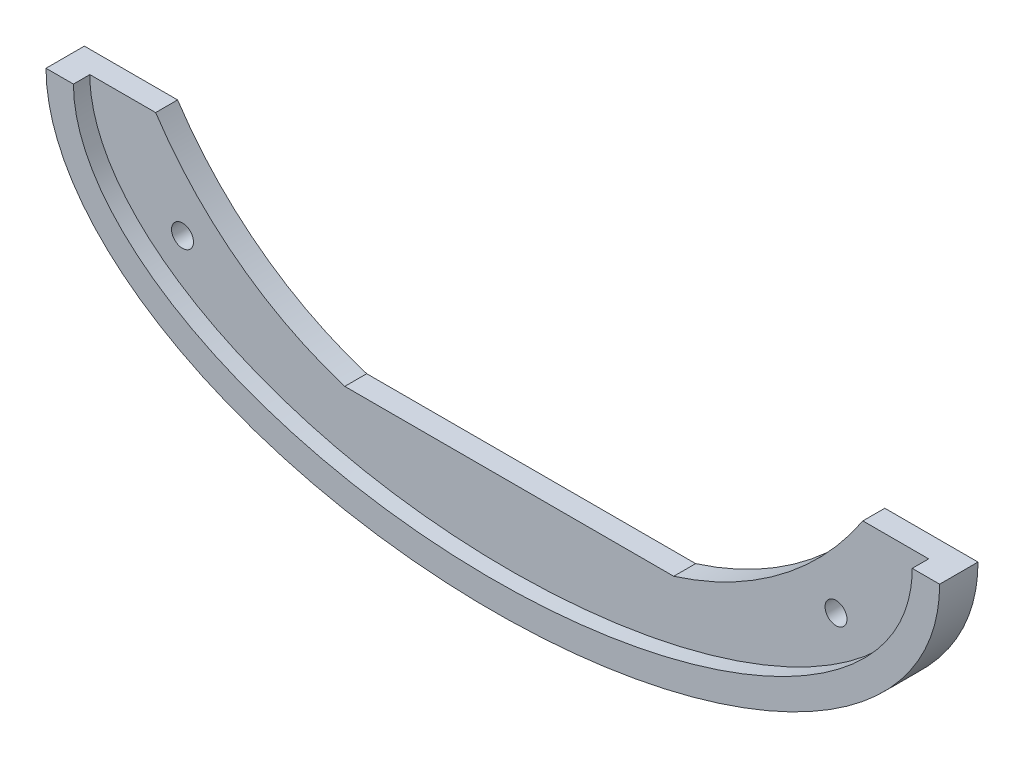
ISO-10303-21;
HEADER;
FILE_DESCRIPTION(('STEP AP214'),'2;1');
FILE_NAME('part.step','',(''),(''),'','','');
FILE_SCHEMA(('AUTOMOTIVE_DESIGN { 1 0 10303 214 1 1 1 1 }'));
ENDSEC;
DATA;
#1=APPLICATION_CONTEXT('core data for automotive mechanical design processes');
#2=APPLICATION_PROTOCOL_DEFINITION('international standard','automotive_design',2000,#1);
#3=PRODUCT_CONTEXT('',#1,'mechanical');
#4=PRODUCT('Part','Part','',(#3));
#5=PRODUCT_RELATED_PRODUCT_CATEGORY('part','',(#4));
#6=PRODUCT_DEFINITION_FORMATION('','',#4);
#7=PRODUCT_DEFINITION_CONTEXT('part definition',#1,'design');
#8=PRODUCT_DEFINITION('design','',#6,#7);
#9=PRODUCT_DEFINITION_SHAPE('','',#8);
#10=(LENGTH_UNIT() NAMED_UNIT(*) SI_UNIT(.MILLI.,.METRE.));
#11=(NAMED_UNIT(*) PLANE_ANGLE_UNIT() SI_UNIT($,.RADIAN.));
#12=(NAMED_UNIT(*) SI_UNIT($,.STERADIAN.) SOLID_ANGLE_UNIT());
#13=UNCERTAINTY_MEASURE_WITH_UNIT(LENGTH_MEASURE(1.E-05),#10,'distance_accuracy_value','');
#14=(GEOMETRIC_REPRESENTATION_CONTEXT(3) GLOBAL_UNCERTAINTY_ASSIGNED_CONTEXT((#13)) GLOBAL_UNIT_ASSIGNED_CONTEXT((#10,
#11,#12)) REPRESENTATION_CONTEXT('',''));
#15=CARTESIAN_POINT('',(0.,0.,0.));
#16=DIRECTION('',(0.,0.,1.));
#17=DIRECTION('',(1.,0.,0.));
#18=AXIS2_PLACEMENT_3D('',#15,#16,#17);
#19=CARTESIAN_POINT('',(0.,40.,-176.386654892759));
#20=DIRECTION('',(0.,0.,1.));
#21=DIRECTION('',(1.,0.,0.));
#22=AXIS2_PLACEMENT_3D('',#19,#20,#21);
#23=ELLIPSE('',#22,76.5,40.);
#24=DIRECTION('',(0.,0.,1.));
#25=VECTOR('',#24,1.);
#26=SURFACE_OF_LINEAR_EXTRUSION('',#23,#25);
#27=CARTESIAN_POINT('',(0.,40.,-3.));
#28=DIRECTION('',(0.,0.,-1.));
#29=DIRECTION('',(1.,0.,0.));
#30=AXIS2_PLACEMENT_3D('',#27,#28,#29);
#31=ELLIPSE('',#30,76.5,40.);
#32=CARTESIAN_POINT('',(76.5,40.,-3.00000000000006));
#33=VERTEX_POINT('',#32);
#34=CARTESIAN_POINT('',(-76.5,40.,-3.));
#35=VERTEX_POINT('',#34);
#36=EDGE_CURVE('E181',#33,#35,#31,.T.);
#37=ORIENTED_EDGE('',*,*,#36,.T.);
#38=DIRECTION('',(0.,0.,1.));
#39=VECTOR('',#38,1.);
#40=CARTESIAN_POINT('',(-76.5,40.,-176.386654892759));
#41=LINE('',#40,#39);
#42=CARTESIAN_POINT('',(-76.5,40.,0.));
#43=VERTEX_POINT('',#42);
#44=EDGE_CURVE('E155',#35,#43,#41,.T.);
#45=ORIENTED_EDGE('',*,*,#44,.T.);
#46=CARTESIAN_POINT('',(0.,40.,0.));
#47=DIRECTION('',(0.,0.,1.));
#48=DIRECTION('',(1.,0.,0.));
#49=AXIS2_PLACEMENT_3D('',#46,#47,#48);
#50=ELLIPSE('',#49,76.5,40.);
#51=CARTESIAN_POINT('',(76.5,40.,0.));
#52=VERTEX_POINT('',#51);
#53=EDGE_CURVE('E48',#43,#52,#50,.T.);
#54=ORIENTED_EDGE('',*,*,#53,.T.);
#55=DIRECTION('',(0.,0.,1.));
#56=VECTOR('',#55,1.);
#57=CARTESIAN_POINT('',(76.5,40.,-176.386654892759));
#58=LINE('',#57,#56);
#59=EDGE_CURVE('E55',#33,#52,#58,.T.);
#60=ORIENTED_EDGE('',*,*,#59,.F.);
#61=EDGE_LOOP('',(#37,#45,#54,#60));
#62=FACE_BOUND('',#61,.T.);
#63=ADVANCED_FACE('F38',(#62),#26,.F.);
#64=CARTESIAN_POINT('',(64.5,40.,4.));
#65=DIRECTION('',(0.,-1.,0.));
#66=DIRECTION('',(0.,0.,-1.));
#67=AXIS2_PLACEMENT_3D('',#64,#65,#66);
#68=PLANE('',#67);
#69=ORIENTED_EDGE('',*,*,#59,.T.);
#70=DIRECTION('',(1.,0.,0.));
#71=VECTOR('',#70,1.);
#72=CARTESIAN_POINT('',(-81.5,40.,0.));
#73=LINE('',#72,#71);
#74=CARTESIAN_POINT('',(81.5,40.,0.));
#75=VERTEX_POINT('',#74);
#76=EDGE_CURVE('E107',#52,#75,#73,.T.);
#77=ORIENTED_EDGE('',*,*,#76,.T.);
#78=DIRECTION('',(0.,0.,1.));
#79=VECTOR('',#78,1.);
#80=CARTESIAN_POINT('',(81.5,40.,-176.386654892759));
#81=LINE('',#80,#79);
#82=CARTESIAN_POINT('',(81.5,40.,-7.00000000000001));
#83=VERTEX_POINT('',#82);
#84=EDGE_CURVE('E116',#83,#75,#81,.T.);
#85=ORIENTED_EDGE('',*,*,#84,.F.);
#86=DIRECTION('',(-1.,0.,0.));
#87=VECTOR('',#86,1.);
#88=CARTESIAN_POINT('',(81.5,40.,-7.00000000000001));
#89=LINE('',#88,#87);
#90=CARTESIAN_POINT('',(64.5,40.,-7.));
#91=VERTEX_POINT('',#90);
#92=EDGE_CURVE('E63',#83,#91,#89,.T.);
#93=ORIENTED_EDGE('',*,*,#92,.T.);
#94=DIRECTION('',(0.,0.,1.));
#95=VECTOR('',#94,1.);
#96=CARTESIAN_POINT('',(64.5,40.,-7.));
#97=LINE('',#96,#95);
#98=CARTESIAN_POINT('',(64.5,40.,-3.));
#99=VERTEX_POINT('',#98);
#100=EDGE_CURVE('E171',#91,#99,#97,.T.);
#101=ORIENTED_EDGE('',*,*,#100,.T.);
#102=DIRECTION('',(1.,0.,0.));
#103=VECTOR('',#102,1.);
#104=CARTESIAN_POINT('',(76.5,40.,-3.));
#105=LINE('',#104,#103);
#106=EDGE_CURVE('E183',#99,#33,#105,.T.);
#107=ORIENTED_EDGE('',*,*,#106,.T.);
#108=EDGE_LOOP('',(#69,#77,#85,#93,#101,#107));
#109=FACE_BOUND('',#108,.T.);
#110=ADVANCED_FACE('F40',(#109),#68,.F.);
#111=CARTESIAN_POINT('',(-76.5,40.,4.));
#112=DIRECTION('',(0.,-1.,0.));
#113=DIRECTION('',(0.,0.,-1.));
#114=AXIS2_PLACEMENT_3D('',#111,#112,#113);
#115=PLANE('',#114);
#116=DIRECTION('',(0.,0.,1.));
#117=VECTOR('',#116,1.);
#118=CARTESIAN_POINT('',(-81.5,40.,-176.386654892759));
#119=LINE('',#118,#117);
#120=CARTESIAN_POINT('',(-81.5,40.,-7.00000000000001));
#121=VERTEX_POINT('',#120);
#122=CARTESIAN_POINT('',(-81.5,40.,0.));
#123=VERTEX_POINT('',#122);
#124=EDGE_CURVE('E121',#121,#123,#119,.T.);
#125=ORIENTED_EDGE('',*,*,#124,.T.);
#126=EDGE_CURVE('E109',#123,#43,#73,.T.);
#127=ORIENTED_EDGE('',*,*,#126,.T.);
#128=ORIENTED_EDGE('',*,*,#44,.F.);
#129=DIRECTION('',(1.,0.,0.));
#130=VECTOR('',#129,1.);
#131=CARTESIAN_POINT('',(-64.5,40.,-3.));
#132=LINE('',#131,#130);
#133=CARTESIAN_POINT('',(-64.5,40.,-3.));
#134=VERTEX_POINT('',#133);
#135=EDGE_CURVE('E178',#35,#134,#132,.T.);
#136=ORIENTED_EDGE('',*,*,#135,.T.);
#137=DIRECTION('',(0.,0.,1.));
#138=VECTOR('',#137,1.);
#139=CARTESIAN_POINT('',(-64.5,40.,-7.));
#140=LINE('',#139,#138);
#141=CARTESIAN_POINT('',(-64.5,40.,-7.));
#142=VERTEX_POINT('',#141);
#143=EDGE_CURVE('E174',#142,#134,#140,.T.);
#144=ORIENTED_EDGE('',*,*,#143,.F.);
#145=DIRECTION('',(1.,0.,0.));
#146=VECTOR('',#145,1.);
#147=CARTESIAN_POINT('',(-81.5,40.,-7.00000000000001));
#148=LINE('',#147,#146);
#149=EDGE_CURVE('E154',#121,#142,#148,.T.);
#150=ORIENTED_EDGE('',*,*,#149,.F.);
#151=EDGE_LOOP('',(#125,#127,#128,#136,#144,#150));
#152=FACE_BOUND('',#151,.T.);
#153=ADVANCED_FACE('F145',(#152),#115,.F.);
#154=CARTESIAN_POINT('',(0.,40.,-7.));
#155=DIRECTION('',(0.,0.,-1.));
#156=DIRECTION('',(-1.,0.,0.));
#157=AXIS2_PLACEMENT_3D('',#154,#155,#156);
#158=PLANE('',#157);
#159=CARTESIAN_POINT('',(-81.5,40.,-7.00000000000006));
#160=CARTESIAN_POINT('',(-81.5,36.7505295268644,-7.00000000000006));
#161=CARTESIAN_POINT('',(-80.2609957361757,30.2809682014024,-7.00000000000006));
#162=CARTESIAN_POINT('',(-73.3217409081439,18.4427697279927,-7.00000000000006));
#163=CARTESIAN_POINT('',(-57.7397657128275,6.42877793137961,-7.00000000000006));
#164=CARTESIAN_POINT('',(-31.0655415341109,-2.85144915391041,-7.00000000000006));
#165=CARTESIAN_POINT('',(0.,-6.07427542304479,-7.00000000000006));
#166=CARTESIAN_POINT('',(31.0655415341109,-2.85144915391042,-7.00000000000006));
#167=CARTESIAN_POINT('',(57.7397657128275,6.42877793137959,-7.00000000000006));
#168=CARTESIAN_POINT('',(73.3217409081439,18.4427697279927,-7.00000000000006));
#169=CARTESIAN_POINT('',(80.2609957361757,30.2809682014024,-7.00000000000006));
#170=CARTESIAN_POINT('',(81.5,36.7505295268644,-7.00000000000006));
#171=CARTESIAN_POINT('',(81.5,40.,-7.00000000000006));
#172=B_SPLINE_CURVE_WITH_KNOTS('',3,(#159,#160,#161,#162,#163,#164,#165,#166,#167,#168,#169,
#170,#171),.UNSPECIFIED.,.F.,.F.,(4,1,1,1,1,1,1,1,1,1,4),(3.14159265358979,3.33794219443916,
3.53429173528852,3.92699081698724,4.31968989868597,4.71238898038469,5.10508806208341,
5.49778714378214,5.89048622548086,6.08683576633022,6.28318530717959),.UNSPECIFIED.);
#173=EDGE_CURVE('E119',#121,#83,#172,.T.);
#174=ORIENTED_EDGE('',*,*,#173,.F.);
#175=ORIENTED_EDGE('',*,*,#149,.T.);
#176=CARTESIAN_POINT('',(-10.6544644361917,75.5594606519764,-7.));
#177=DIRECTION('',(0.,0.,1.));
#178=DIRECTION('',(-1.,0.,0.));
#179=AXIS2_PLACEMENT_3D('',#176,#177,#178);
#180=CIRCLE('',#179,64.5276447889802);
#181=CARTESIAN_POINT('',(-30.,14.,-7.));
#182=VERTEX_POINT('',#181);
#183=EDGE_CURVE('E180',#142,#182,#180,.T.);
#184=ORIENTED_EDGE('',*,*,#183,.T.);
#185=DIRECTION('',(1.,0.,0.));
#186=VECTOR('',#185,1.);
#187=CARTESIAN_POINT('',(30.,14.,-7.));
#188=LINE('',#187,#186);
#189=CARTESIAN_POINT('',(30.,14.,-7.));
#190=VERTEX_POINT('',#189);
#191=EDGE_CURVE('E194',#182,#190,#188,.T.);
#192=ORIENTED_EDGE('',*,*,#191,.T.);
#193=CARTESIAN_POINT('',(10.6544644361917,75.5594606519764,-7.));
#194=DIRECTION('',(0.,0.,1.));
#195=DIRECTION('',(-1.,0.,0.));
#196=AXIS2_PLACEMENT_3D('',#193,#194,#195);
#197=CIRCLE('',#196,64.5276447889802);
#198=EDGE_CURVE('E177',#190,#91,#197,.T.);
#199=ORIENTED_EDGE('',*,*,#198,.T.);
#200=ORIENTED_EDGE('',*,*,#92,.F.);
#201=EDGE_LOOP('',(#174,#175,#184,#192,#199,#200));
#202=FACE_BOUND('',#201,.T.);
#203=CARTESIAN_POINT('',(59.6,23.,-7.));
#204=DIRECTION('',(0.,0.,-1.));
#205=DIRECTION('',(-1.,0.,0.));
#206=AXIS2_PLACEMENT_3D('',#203,#204,#205);
#207=CIRCLE('',#206,2.);
#208=CARTESIAN_POINT('',(57.6,23.,-7.));
#209=VERTEX_POINT('',#208);
#210=EDGE_CURVE('E192',#209,#209,#207,.T.);
#211=ORIENTED_EDGE('',*,*,#210,.F.);
#212=EDGE_LOOP('',(#211));
#213=FACE_BOUND('',#212,.T.);
#214=CARTESIAN_POINT('',(-59.6,23.,-7.));
#215=DIRECTION('',(0.,0.,-1.));
#216=DIRECTION('',(-1.,0.,0.));
#217=AXIS2_PLACEMENT_3D('',#214,#215,#216);
#218=CIRCLE('',#217,2.);
#219=CARTESIAN_POINT('',(-61.6,23.,-7.));
#220=VERTEX_POINT('',#219);
#221=EDGE_CURVE('E201',#220,#220,#218,.T.);
#222=ORIENTED_EDGE('',*,*,#221,.F.);
#223=EDGE_LOOP('',(#222));
#224=FACE_BOUND('',#223,.T.);
#225=ADVANCED_FACE('F139',(#202,#213,#224),#158,.T.);
#226=CARTESIAN_POINT('',(-81.5,40.,-176.386654892759));
#227=CARTESIAN_POINT('',(-81.5,36.7505295268644,-176.386654892759));
#228=CARTESIAN_POINT('',(-80.2609957361757,30.2809682014024,-176.386654892759));
#229=CARTESIAN_POINT('',(-73.3217409081439,18.4427697279927,-176.386654892759));
#230=CARTESIAN_POINT('',(-57.7397657128275,6.42877793137961,-176.386654892759));
#231=CARTESIAN_POINT('',(-31.0655415341109,-2.85144915391041,-176.386654892759));
#232=CARTESIAN_POINT('',(0.,-6.07427542304479,-176.386654892759));
#233=CARTESIAN_POINT('',(31.0655415341109,-2.85144915391042,-176.386654892759));
#234=CARTESIAN_POINT('',(57.7397657128275,6.42877793137959,-176.386654892759));
#235=CARTESIAN_POINT('',(73.3217409081439,18.4427697279927,-176.386654892759));
#236=CARTESIAN_POINT('',(80.2609957361757,30.2809682014024,-176.386654892759));
#237=CARTESIAN_POINT('',(81.5,36.7505295268644,-176.386654892759));
#238=CARTESIAN_POINT('',(81.5,40.,-176.386654892759));
#239=B_SPLINE_CURVE_WITH_KNOTS('',3,(#226,#227,#228,#229,#230,#231,#232,#233,#234,#235,#236,
#237,#238),.UNSPECIFIED.,.F.,.F.,(4,1,1,1,1,1,1,1,1,1,4),(3.14159265358979,3.33794219443916,
3.53429173528852,3.92699081698724,4.31968989868597,4.71238898038469,5.10508806208341,
5.49778714378214,5.89048622548086,6.08683576633022,6.28318530717959),.UNSPECIFIED.);
#240=DIRECTION('',(0.,0.,1.));
#241=VECTOR('',#240,1.);
#242=SURFACE_OF_LINEAR_EXTRUSION('',#239,#241);
#243=CARTESIAN_POINT('',(-81.5,40.,0.));
#244=CARTESIAN_POINT('',(-81.5,36.7505295268644,0.));
#245=CARTESIAN_POINT('',(-80.2609957361757,30.2809682014024,0.));
#246=CARTESIAN_POINT('',(-73.3217409081439,18.4427697279927,0.));
#247=CARTESIAN_POINT('',(-57.7397657128275,6.42877793137961,0.));
#248=CARTESIAN_POINT('',(-31.0655415341109,-2.85144915391041,0.));
#249=CARTESIAN_POINT('',(0.,-6.07427542304479,0.));
#250=CARTESIAN_POINT('',(31.0655415341109,-2.85144915391042,0.));
#251=CARTESIAN_POINT('',(57.7397657128275,6.42877793137959,0.));
#252=CARTESIAN_POINT('',(73.3217409081439,18.4427697279927,0.));
#253=CARTESIAN_POINT('',(80.2609957361757,30.2809682014024,0.));
#254=CARTESIAN_POINT('',(81.5,36.7505295268644,0.));
#255=CARTESIAN_POINT('',(81.5,40.,0.));
#256=B_SPLINE_CURVE_WITH_KNOTS('',3,(#243,#244,#245,#246,#247,#248,#249,#250,#251,#252,#253,
#254,#255),.UNSPECIFIED.,.F.,.F.,(4,1,1,1,1,1,1,1,1,1,4),(3.14159265358979,3.33794219443916,
3.53429173528852,3.92699081698724,4.31968989868597,4.71238898038469,5.10508806208341,
5.49778714378214,5.89048622548086,6.08683576633022,6.28318530717959),.UNSPECIFIED.);
#257=EDGE_CURVE('E11',#123,#75,#256,.T.);
#258=ORIENTED_EDGE('',*,*,#257,.F.);
#259=ORIENTED_EDGE('',*,*,#124,.F.);
#260=ORIENTED_EDGE('',*,*,#173,.T.);
#261=ORIENTED_EDGE('',*,*,#84,.T.);
#262=EDGE_LOOP('',(#258,#259,#260,#261));
#263=FACE_BOUND('',#262,.T.);
#264=ADVANCED_FACE('F118',(#263),#242,.T.);
#265=CARTESIAN_POINT('',(0.,40.,-3.));
#266=DIRECTION('',(0.,0.,-1.));
#267=DIRECTION('',(-1.,0.,0.));
#268=AXIS2_PLACEMENT_3D('',#265,#266,#267);
#269=PLANE('',#268);
#270=CARTESIAN_POINT('',(-10.6544644361917,75.5594606519764,-3.));
#271=DIRECTION('',(0.,0.,1.));
#272=DIRECTION('',(-1.,0.,0.));
#273=AXIS2_PLACEMENT_3D('',#270,#271,#272);
#274=CIRCLE('',#273,64.5276447889802);
#275=CARTESIAN_POINT('',(-30.,14.,-3.));
#276=VERTEX_POINT('',#275);
#277=EDGE_CURVE('E189',#134,#276,#274,.T.);
#278=ORIENTED_EDGE('',*,*,#277,.F.);
#279=ORIENTED_EDGE('',*,*,#135,.F.);
#280=ORIENTED_EDGE('',*,*,#36,.F.);
#281=ORIENTED_EDGE('',*,*,#106,.F.);
#282=CARTESIAN_POINT('',(10.6544644361917,75.5594606519764,-3.));
#283=DIRECTION('',(0.,0.,1.));
#284=DIRECTION('',(-1.,0.,0.));
#285=AXIS2_PLACEMENT_3D('',#282,#283,#284);
#286=CIRCLE('',#285,64.5276447889802);
#287=CARTESIAN_POINT('',(30.,14.,-3.));
#288=VERTEX_POINT('',#287);
#289=EDGE_CURVE('E185',#288,#99,#286,.T.);
#290=ORIENTED_EDGE('',*,*,#289,.F.);
#291=DIRECTION('',(1.,0.,0.));
#292=VECTOR('',#291,1.);
#293=CARTESIAN_POINT('',(30.,14.,-3.));
#294=LINE('',#293,#292);
#295=EDGE_CURVE('E187',#276,#288,#294,.T.);
#296=ORIENTED_EDGE('',*,*,#295,.F.);
#297=EDGE_LOOP('',(#278,#279,#280,#281,#290,#296));
#298=FACE_BOUND('',#297,.T.);
#299=CARTESIAN_POINT('',(59.6,23.,-3.));
#300=DIRECTION('',(0.,0.,-1.));
#301=DIRECTION('',(-1.,0.,0.));
#302=AXIS2_PLACEMENT_3D('',#299,#300,#301);
#303=CIRCLE('',#302,2.);
#304=CARTESIAN_POINT('',(57.6,23.,-3.));
#305=VERTEX_POINT('',#304);
#306=EDGE_CURVE('E198',#305,#305,#303,.T.);
#307=ORIENTED_EDGE('',*,*,#306,.T.);
#308=EDGE_LOOP('',(#307));
#309=FACE_BOUND('',#308,.T.);
#310=CARTESIAN_POINT('',(-59.6,23.,-3.));
#311=DIRECTION('',(0.,0.,-1.));
#312=DIRECTION('',(-1.,0.,0.));
#313=AXIS2_PLACEMENT_3D('',#310,#311,#312);
#314=CIRCLE('',#313,2.);
#315=CARTESIAN_POINT('',(-61.6,23.,-3.));
#316=VERTEX_POINT('',#315);
#317=EDGE_CURVE('E204',#316,#316,#314,.T.);
#318=ORIENTED_EDGE('',*,*,#317,.T.);
#319=EDGE_LOOP('',(#318));
#320=FACE_BOUND('',#319,.T.);
#321=ADVANCED_FACE('F138',(#298,#309,#320),#269,.F.);
#322=CARTESIAN_POINT('',(-10.6544644361917,75.5594606519764,-7.));
#323=DIRECTION('',(0.,0.,1.));
#324=DIRECTION('',(1.,0.,0.));
#325=AXIS2_PLACEMENT_3D('',#322,#323,#324);
#326=CYLINDRICAL_SURFACE('',#325,64.5276447889802);
#327=ORIENTED_EDGE('',*,*,#277,.T.);
#328=DIRECTION('',(0.,0.,1.));
#329=VECTOR('',#328,1.);
#330=CARTESIAN_POINT('',(-30.,14.,-7.));
#331=LINE('',#330,#329);
#332=EDGE_CURVE('E158',#182,#276,#331,.T.);
#333=ORIENTED_EDGE('',*,*,#332,.F.);
#334=ORIENTED_EDGE('',*,*,#183,.F.);
#335=ORIENTED_EDGE('',*,*,#143,.T.);
#336=EDGE_LOOP('',(#327,#333,#334,#335));
#337=FACE_BOUND('',#336,.T.);
#338=ADVANCED_FACE('F140',(#337),#326,.F.);
#339=CARTESIAN_POINT('',(30.,14.,-7.));
#340=DIRECTION('',(0.,-1.,0.));
#341=DIRECTION('',(1.,0.,0.));
#342=AXIS2_PLACEMENT_3D('',#339,#340,#341);
#343=PLANE('',#342);
#344=ORIENTED_EDGE('',*,*,#295,.T.);
#345=DIRECTION('',(0.,0.,1.));
#346=VECTOR('',#345,1.);
#347=CARTESIAN_POINT('',(30.,14.,-7.));
#348=LINE('',#347,#346);
#349=EDGE_CURVE('E168',#190,#288,#348,.T.);
#350=ORIENTED_EDGE('',*,*,#349,.F.);
#351=ORIENTED_EDGE('',*,*,#191,.F.);
#352=ORIENTED_EDGE('',*,*,#332,.T.);
#353=EDGE_LOOP('',(#344,#350,#351,#352));
#354=FACE_BOUND('',#353,.T.);
#355=ADVANCED_FACE('F224',(#354),#343,.F.);
#356=CARTESIAN_POINT('',(10.6544644361917,75.5594606519764,-7.));
#357=DIRECTION('',(0.,0.,1.));
#358=DIRECTION('',(1.,0.,0.));
#359=AXIS2_PLACEMENT_3D('',#356,#357,#358);
#360=CYLINDRICAL_SURFACE('',#359,64.5276447889802);
#361=ORIENTED_EDGE('',*,*,#289,.T.);
#362=ORIENTED_EDGE('',*,*,#100,.F.);
#363=ORIENTED_EDGE('',*,*,#198,.F.);
#364=ORIENTED_EDGE('',*,*,#349,.T.);
#365=EDGE_LOOP('',(#361,#362,#363,#364));
#366=FACE_BOUND('',#365,.T.);
#367=ADVANCED_FACE('F230',(#366),#360,.F.);
#368=CARTESIAN_POINT('',(59.6,23.,-7.));
#369=DIRECTION('',(0.,0.,1.));
#370=DIRECTION('',(1.,0.,0.));
#371=AXIS2_PLACEMENT_3D('',#368,#369,#370);
#372=CYLINDRICAL_SURFACE('',#371,2.);
#373=ORIENTED_EDGE('',*,*,#210,.T.);
#374=EDGE_LOOP('',(#373));
#375=FACE_BOUND('',#374,.T.);
#376=ORIENTED_EDGE('',*,*,#306,.F.);
#377=EDGE_LOOP('',(#376));
#378=FACE_BOUND('',#377,.T.);
#379=ADVANCED_FACE('F214',(#375,#378),#372,.F.);
#380=CARTESIAN_POINT('',(-59.6,23.,-7.));
#381=DIRECTION('',(0.,0.,1.));
#382=DIRECTION('',(1.,0.,0.));
#383=AXIS2_PLACEMENT_3D('',#380,#381,#382);
#384=CYLINDRICAL_SURFACE('',#383,2.);
#385=ORIENTED_EDGE('',*,*,#221,.T.);
#386=EDGE_LOOP('',(#385));
#387=FACE_BOUND('',#386,.T.);
#388=ORIENTED_EDGE('',*,*,#317,.F.);
#389=EDGE_LOOP('',(#388));
#390=FACE_BOUND('',#389,.T.);
#391=ADVANCED_FACE('F210',(#387,#390),#384,.F.);
#392=CARTESIAN_POINT('',(-81.5,40.,0.));
#393=DIRECTION('',(0.,0.,-1.));
#394=DIRECTION('',(-1.,0.,0.));
#395=AXIS2_PLACEMENT_3D('',#392,#393,#394);
#396=PLANE('',#395);
#397=ORIENTED_EDGE('',*,*,#126,.F.);
#398=ORIENTED_EDGE('',*,*,#257,.T.);
#399=ORIENTED_EDGE('',*,*,#76,.F.);
#400=ORIENTED_EDGE('',*,*,#53,.F.);
#401=EDGE_LOOP('',(#397,#398,#399,#400));
#402=FACE_BOUND('',#401,.T.);
#403=ADVANCED_FACE('F106',(#402),#396,.F.);
#404=CLOSED_SHELL('',(#63,#110,#153,#225,#264,#321,#338,#355,#367,#379,#391,#403));
#405=MANIFOLD_SOLID_BREP('B2',#404);
#406=ADVANCED_BREP_SHAPE_REPRESENTATION('',(#18,#405),#14);
#407=SHAPE_DEFINITION_REPRESENTATION(#9,#406);
ENDSEC;
END-ISO-10303-21;
